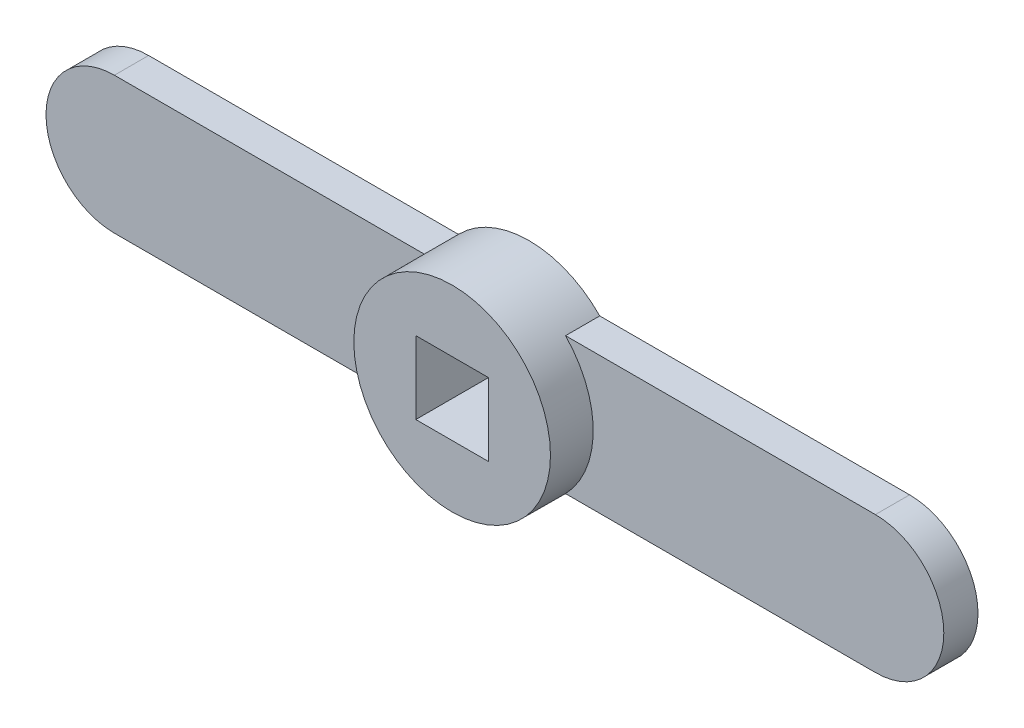
ISO-10303-21;
HEADER;
FILE_DESCRIPTION(('STEP AP214'),'2;1');
FILE_NAME('part.step','',(''),(''),'','','');
FILE_SCHEMA(('AUTOMOTIVE_DESIGN { 1 0 10303 214 1 1 1 1 }'));
ENDSEC;
DATA;
#1=APPLICATION_CONTEXT('core data for automotive mechanical design processes');
#2=APPLICATION_PROTOCOL_DEFINITION('international standard','automotive_design',2000,#1);
#3=PRODUCT_CONTEXT('',#1,'mechanical');
#4=PRODUCT('Part','Part','',(#3));
#5=PRODUCT_RELATED_PRODUCT_CATEGORY('part','',(#4));
#6=PRODUCT_DEFINITION_FORMATION('','',#4);
#7=PRODUCT_DEFINITION_CONTEXT('part definition',#1,'design');
#8=PRODUCT_DEFINITION('design','',#6,#7);
#9=PRODUCT_DEFINITION_SHAPE('','',#8);
#10=(LENGTH_UNIT() NAMED_UNIT(*) SI_UNIT(.MILLI.,.METRE.));
#11=(NAMED_UNIT(*) PLANE_ANGLE_UNIT() SI_UNIT($,.RADIAN.));
#12=(NAMED_UNIT(*) SI_UNIT($,.STERADIAN.) SOLID_ANGLE_UNIT());
#13=UNCERTAINTY_MEASURE_WITH_UNIT(LENGTH_MEASURE(1.E-05),#10,'distance_accuracy_value','');
#14=(GEOMETRIC_REPRESENTATION_CONTEXT(3) GLOBAL_UNCERTAINTY_ASSIGNED_CONTEXT((#13)) GLOBAL_UNIT_ASSIGNED_CONTEXT((#10,
#11,#12)) REPRESENTATION_CONTEXT('',''));
#15=CARTESIAN_POINT('',(0.,0.,0.));
#16=DIRECTION('',(0.,0.,1.));
#17=DIRECTION('',(1.,0.,0.));
#18=AXIS2_PLACEMENT_3D('',#15,#16,#17);
#19=CARTESIAN_POINT('',(-44.5000000000006,-8.00000000000008,4.));
#20=DIRECTION('',(0.,1.00000000000002,0.));
#21=DIRECTION('',(0.,0.,1.));
#22=AXIS2_PLACEMENT_3D('',#19,#20,#21);
#23=PLANE('',#22);
#24=DIRECTION('',(1.00000000000002,0.,0.));
#25=VECTOR('',#24,1.);
#26=CARTESIAN_POINT('',(-44.5000000000006,-8.00000000000008,4.));
#27=LINE('',#26,#25);
#28=CARTESIAN_POINT('',(8.26135582092915,-8.00000000000007,4.));
#29=VERTEX_POINT('',#28);
#30=CARTESIAN_POINT('',(44.5000000000007,-8.00000000000008,4.));
#31=VERTEX_POINT('',#30);
#32=EDGE_CURVE('E195',#29,#31,#27,.T.);
#33=ORIENTED_EDGE('',*,*,#32,.F.);
#34=DIRECTION('',(0.,0.,-1.));
#35=VECTOR('',#34,1.);
#36=CARTESIAN_POINT('',(8.26135582092915,-8.00000000000007,8.99999999999999));
#37=LINE('',#36,#35);
#38=CARTESIAN_POINT('',(8.26135582092916,-8.00000000000015,0.));
#39=VERTEX_POINT('',#38);
#40=EDGE_CURVE('E185',#29,#39,#37,.T.);
#41=ORIENTED_EDGE('',*,*,#40,.T.);
#42=DIRECTION('',(1.00000000000002,0.,0.));
#43=VECTOR('',#42,1.);
#44=CARTESIAN_POINT('',(-44.5000000000007,-8.00000000000015,0.));
#45=LINE('',#44,#43);
#46=CARTESIAN_POINT('',(44.5000000000001,-8.00000000000014,0.));
#47=VERTEX_POINT('',#46);
#48=EDGE_CURVE('E208',#39,#47,#45,.T.);
#49=ORIENTED_EDGE('',*,*,#48,.T.);
#50=DIRECTION('',(0.,0.,-1.));
#51=VECTOR('',#50,1.);
#52=CARTESIAN_POINT('',(44.5000000000007,-8.00000000000008,4.));
#53=LINE('',#52,#51);
#54=EDGE_CURVE('E54',#31,#47,#53,.T.);
#55=ORIENTED_EDGE('',*,*,#54,.F.);
#56=EDGE_LOOP('',(#33,#41,#49,#55));
#57=FACE_BOUND('',#56,.T.);
#58=ADVANCED_FACE('F46',(#57),#23,.F.);
#59=CARTESIAN_POINT('',(-44.5000000000006,8.00000000000023,3.99999999999935));
#60=DIRECTION('',(0.,-1.00000000000002,0.));
#61=DIRECTION('',(0.,0.,-1.));
#62=AXIS2_PLACEMENT_3D('',#59,#60,#61);
#63=PLANE('',#62);
#64=DIRECTION('',(-1.00000000000002,0.,0.));
#65=VECTOR('',#64,1.);
#66=CARTESIAN_POINT('',(-44.5000000000006,8.00000000000023,3.99999999999935));
#67=LINE('',#66,#65);
#68=CARTESIAN_POINT('',(-8.26135582092946,8.00000000000024,4.));
#69=VERTEX_POINT('',#68);
#70=CARTESIAN_POINT('',(-44.5000000000006,8.00000000000023,3.99999999999935));
#71=VERTEX_POINT('',#70);
#72=EDGE_CURVE('E202',#69,#71,#67,.T.);
#73=ORIENTED_EDGE('',*,*,#72,.F.);
#74=DIRECTION('',(0.,0.,-1.));
#75=VECTOR('',#74,1.);
#76=CARTESIAN_POINT('',(-8.26135582092948,8.00000000000025,9.00000000000001));
#77=LINE('',#76,#75);
#78=CARTESIAN_POINT('',(-8.26135582092946,8.00000000000016,0.));
#79=VERTEX_POINT('',#78);
#80=EDGE_CURVE('E187',#69,#79,#77,.T.);
#81=ORIENTED_EDGE('',*,*,#80,.T.);
#82=DIRECTION('',(-1.00000000000002,0.,0.));
#83=VECTOR('',#82,1.);
#84=CARTESIAN_POINT('',(-44.5000000000006,8.00000000000016,-6.24500451351651E-13));
#85=LINE('',#84,#83);
#86=CARTESIAN_POINT('',(-44.5000000000006,8.00000000000016,-6.24500451351651E-13));
#87=VERTEX_POINT('',#86);
#88=EDGE_CURVE('E213',#79,#87,#85,.T.);
#89=ORIENTED_EDGE('',*,*,#88,.T.);
#90=DIRECTION('',(0.,0.,-1.));
#91=VECTOR('',#90,1.);
#92=CARTESIAN_POINT('',(-44.5000000000006,8.00000000000023,3.99999999999935));
#93=LINE('',#92,#91);
#94=EDGE_CURVE('E205',#71,#87,#93,.T.);
#95=ORIENTED_EDGE('',*,*,#94,.F.);
#96=EDGE_LOOP('',(#73,#81,#89,#95));
#97=FACE_BOUND('',#96,.T.);
#98=ADVANCED_FACE('F248',(#97),#63,.F.);
#99=CARTESIAN_POINT('',(-44.5000000000006,0.,4.));
#100=DIRECTION('',(0.,0.,1.));
#101=DIRECTION('',(1.00000000000002,0.,0.));
#102=AXIS2_PLACEMENT_3D('',#99,#100,#101);
#103=PLANE('',#102);
#104=CARTESIAN_POINT('',(0.,0.,4.));
#105=DIRECTION('',(0.,0.,1.));
#106=DIRECTION('',(1.00000000000002,0.,0.));
#107=AXIS2_PLACEMENT_3D('',#104,#105,#106);
#108=CIRCLE('',#107,11.5);
#109=CARTESIAN_POINT('',(-8.26135582092946,-8.00000000000007,3.99999999999999));
#110=VERTEX_POINT('',#109);
#111=EDGE_CURVE('E182',#69,#110,#108,.T.);
#112=ORIENTED_EDGE('',*,*,#111,.F.);
#113=ORIENTED_EDGE('',*,*,#72,.T.);
#114=CARTESIAN_POINT('',(-44.5000000000006,0.,4.));
#115=DIRECTION('',(0.,0.,1.));
#116=DIRECTION('',(1.00000000000002,0.,0.));
#117=AXIS2_PLACEMENT_3D('',#114,#115,#116);
#118=CIRCLE('',#117,8.);
#119=CARTESIAN_POINT('',(-44.5000000000006,-8.00000000000008,4.));
#120=VERTEX_POINT('',#119);
#121=EDGE_CURVE('E192',#71,#120,#118,.T.);
#122=ORIENTED_EDGE('',*,*,#121,.T.);
#123=EDGE_CURVE('E197',#120,#110,#27,.T.);
#124=ORIENTED_EDGE('',*,*,#123,.T.);
#125=EDGE_LOOP('',(#112,#113,#122,#124));
#126=FACE_BOUND('',#125,.T.);
#127=ADVANCED_FACE('F253',(#126),#103,.T.);
#128=CARTESIAN_POINT('',(-44.5000000000006,0.,4.));
#129=DIRECTION('',(0.,0.,-1.));
#130=DIRECTION('',(-1.00000000000002,0.,0.));
#131=AXIS2_PLACEMENT_3D('',#128,#129,#130);
#132=CYLINDRICAL_SURFACE('',#131,8.);
#133=CARTESIAN_POINT('',(-44.5000000000007,0.,0.));
#134=DIRECTION('',(0.,0.,1.));
#135=DIRECTION('',(1.00000000000002,0.,0.));
#136=AXIS2_PLACEMENT_3D('',#133,#134,#135);
#137=CIRCLE('',#136,8.);
#138=CARTESIAN_POINT('',(-44.5000000000007,-8.00000000000015,0.));
#139=VERTEX_POINT('',#138);
#140=EDGE_CURVE('E191',#87,#139,#137,.T.);
#141=ORIENTED_EDGE('',*,*,#140,.T.);
#142=DIRECTION('',(0.,0.,-1.));
#143=VECTOR('',#142,1.);
#144=CARTESIAN_POINT('',(-44.5000000000006,-8.00000000000008,4.));
#145=LINE('',#144,#143);
#146=EDGE_CURVE('E13',#120,#139,#145,.T.);
#147=ORIENTED_EDGE('',*,*,#146,.F.);
#148=ORIENTED_EDGE('',*,*,#121,.F.);
#149=ORIENTED_EDGE('',*,*,#94,.T.);
#150=EDGE_LOOP('',(#141,#147,#148,#149));
#151=FACE_BOUND('',#150,.T.);
#152=ADVANCED_FACE('F48',(#151),#132,.T.);
#153=CARTESIAN_POINT('',(-8.26135582092946,-8.00000000000015,0.));
#154=VERTEX_POINT('',#153);
#155=EDGE_CURVE('E209',#139,#154,#45,.T.);
#156=ORIENTED_EDGE('',*,*,#155,.T.);
#157=DIRECTION('',(0.,0.,-1.));
#158=VECTOR('',#157,1.);
#159=CARTESIAN_POINT('',(-8.26135582092948,-8.00000000000007,8.99999999999999));
#160=LINE('',#159,#158);
#161=EDGE_CURVE('E189',#154,#110,#160,.F.);
#162=ORIENTED_EDGE('',*,*,#161,.T.);
#163=ORIENTED_EDGE('',*,*,#123,.F.);
#164=ORIENTED_EDGE('',*,*,#146,.T.);
#165=EDGE_LOOP('',(#156,#162,#163,#164));
#166=FACE_BOUND('',#165,.T.);
#167=ADVANCED_FACE('F249',(#166),#23,.F.);
#168=CARTESIAN_POINT('',(44.5000000000007,0.,3.99999999999938));
#169=DIRECTION('',(0.,0.,-1.));
#170=DIRECTION('',(-1.00000000000002,0.,0.));
#171=AXIS2_PLACEMENT_3D('',#168,#169,#170);
#172=CYLINDRICAL_SURFACE('',#171,8.);
#173=CARTESIAN_POINT('',(44.5000000000001,0.,-6.24500451351651E-13));
#174=DIRECTION('',(0.,0.,1.));
#175=DIRECTION('',(1.00000000000002,0.,0.));
#176=AXIS2_PLACEMENT_3D('',#173,#174,#175);
#177=CIRCLE('',#176,8.);
#178=CARTESIAN_POINT('',(44.5000000000001,8.00000000000017,-6.24500451351651E-13));
#179=VERTEX_POINT('',#178);
#180=EDGE_CURVE('E211',#47,#179,#177,.T.);
#181=ORIENTED_EDGE('',*,*,#180,.T.);
#182=DIRECTION('',(0.,0.,-1.));
#183=VECTOR('',#182,1.);
#184=CARTESIAN_POINT('',(44.5000000000006,8.00000000000024,3.99999999999938));
#185=LINE('',#184,#183);
#186=CARTESIAN_POINT('',(44.5000000000006,8.00000000000024,3.99999999999938));
#187=VERTEX_POINT('',#186);
#188=EDGE_CURVE('E217',#187,#179,#185,.T.);
#189=ORIENTED_EDGE('',*,*,#188,.F.);
#190=CARTESIAN_POINT('',(44.5000000000007,0.,3.99999999999938));
#191=DIRECTION('',(0.,0.,1.));
#192=DIRECTION('',(1.00000000000002,0.,0.));
#193=AXIS2_PLACEMENT_3D('',#190,#191,#192);
#194=CIRCLE('',#193,8.);
#195=EDGE_CURVE('E200',#31,#187,#194,.T.);
#196=ORIENTED_EDGE('',*,*,#195,.F.);
#197=ORIENTED_EDGE('',*,*,#54,.T.);
#198=EDGE_LOOP('',(#181,#189,#196,#197));
#199=FACE_BOUND('',#198,.T.);
#200=ADVANCED_FACE('F224',(#199),#172,.T.);
#201=CARTESIAN_POINT('',(8.26135582092914,8.00000000000016,0.));
#202=VERTEX_POINT('',#201);
#203=EDGE_CURVE('E196',#179,#202,#85,.T.);
#204=ORIENTED_EDGE('',*,*,#203,.T.);
#205=DIRECTION('',(0.,0.,-1.));
#206=VECTOR('',#205,1.);
#207=CARTESIAN_POINT('',(8.26135582092913,8.00000000000024,9.00000000000001));
#208=LINE('',#207,#206);
#209=CARTESIAN_POINT('',(8.26135582092916,8.00000000000025,4.));
#210=VERTEX_POINT('',#209);
#211=EDGE_CURVE('E181',#202,#210,#208,.F.);
#212=ORIENTED_EDGE('',*,*,#211,.T.);
#213=EDGE_CURVE('E203',#187,#210,#67,.T.);
#214=ORIENTED_EDGE('',*,*,#213,.F.);
#215=ORIENTED_EDGE('',*,*,#188,.T.);
#216=EDGE_LOOP('',(#204,#212,#214,#215));
#217=FACE_BOUND('',#216,.T.);
#218=ADVANCED_FACE('F238',(#217),#63,.F.);
#219=EDGE_CURVE('E175',#29,#210,#108,.T.);
#220=ORIENTED_EDGE('',*,*,#219,.F.);
#221=ORIENTED_EDGE('',*,*,#32,.T.);
#222=ORIENTED_EDGE('',*,*,#195,.T.);
#223=ORIENTED_EDGE('',*,*,#213,.T.);
#224=EDGE_LOOP('',(#220,#221,#222,#223));
#225=FACE_BOUND('',#224,.T.);
#226=ADVANCED_FACE('F246',(#225),#103,.T.);
#227=CARTESIAN_POINT('',(-44.5000000000007,0.,0.));
#228=DIRECTION('',(0.,0.,1.));
#229=DIRECTION('',(1.00000000000002,0.,0.));
#230=AXIS2_PLACEMENT_3D('',#227,#228,#229);
#231=PLANE('',#230);
#232=DIRECTION('',(1.00000000000002,0.,0.));
#233=VECTOR('',#232,1.);
#234=CARTESIAN_POINT('',(4.24999999999999,4.25000000000009,0.));
#235=LINE('',#234,#233);
#236=CARTESIAN_POINT('',(-4.25000000000016,4.25000000000008,0.));
#237=VERTEX_POINT('',#236);
#238=CARTESIAN_POINT('',(4.24999999999999,4.25000000000009,0.));
#239=VERTEX_POINT('',#238);
#240=EDGE_CURVE('E162',#237,#239,#235,.T.);
#241=ORIENTED_EDGE('',*,*,#240,.F.);
#242=DIRECTION('',(0.,1.00000000000002,0.));
#243=VECTOR('',#242,1.);
#244=CARTESIAN_POINT('',(-4.25000000000016,-4.25000000000007,-6.24500451351651E-13));
#245=LINE('',#244,#243);
#246=CARTESIAN_POINT('',(-4.25000000000016,-4.25000000000007,-6.24500451351651E-13));
#247=VERTEX_POINT('',#246);
#248=EDGE_CURVE('E61',#247,#237,#245,.T.);
#249=ORIENTED_EDGE('',*,*,#248,.F.);
#250=DIRECTION('',(-1.00000000000002,0.,0.));
#251=VECTOR('',#250,1.);
#252=CARTESIAN_POINT('',(4.25,-4.25000000000007,-6.24500451351651E-13));
#253=LINE('',#252,#251);
#254=CARTESIAN_POINT('',(4.25,-4.25000000000007,-6.24500451351651E-13));
#255=VERTEX_POINT('',#254);
#256=EDGE_CURVE('E153',#255,#247,#253,.T.);
#257=ORIENTED_EDGE('',*,*,#256,.F.);
#258=DIRECTION('',(0.,-1.00000000000002,0.));
#259=VECTOR('',#258,1.);
#260=CARTESIAN_POINT('',(4.25,-4.25000000000007,-6.24500451351651E-13));
#261=LINE('',#260,#259);
#262=EDGE_CURVE('E156',#239,#255,#261,.T.);
#263=ORIENTED_EDGE('',*,*,#262,.F.);
#264=EDGE_LOOP('',(#241,#249,#257,#263));
#265=FACE_BOUND('',#264,.T.);
#266=ORIENTED_EDGE('',*,*,#48,.F.);
#267=CARTESIAN_POINT('',(0.,0.,0.));
#268=DIRECTION('',(0.,0.,-1.));
#269=DIRECTION('',(-1.00000000000002,0.,0.));
#270=AXIS2_PLACEMENT_3D('',#267,#268,#269);
#271=CIRCLE('',#270,11.5);
#272=EDGE_CURVE('E168',#39,#154,#271,.T.);
#273=ORIENTED_EDGE('',*,*,#272,.T.);
#274=ORIENTED_EDGE('',*,*,#155,.F.);
#275=ORIENTED_EDGE('',*,*,#140,.F.);
#276=ORIENTED_EDGE('',*,*,#88,.F.);
#277=EDGE_CURVE('E176',#79,#202,#271,.T.);
#278=ORIENTED_EDGE('',*,*,#277,.T.);
#279=ORIENTED_EDGE('',*,*,#203,.F.);
#280=ORIENTED_EDGE('',*,*,#180,.F.);
#281=EDGE_LOOP('',(#266,#273,#274,#275,#276,#278,#279,#280));
#282=FACE_BOUND('',#281,.T.);
#283=ADVANCED_FACE('F231',(#265,#282),#231,.F.);
#284=CARTESIAN_POINT('',(0.,0.,8.99999999999999));
#285=DIRECTION('',(0.,0.,-1.));
#286=DIRECTION('',(-1.00000000000002,0.,0.));
#287=AXIS2_PLACEMENT_3D('',#284,#285,#286);
#288=CYLINDRICAL_SURFACE('',#287,11.5);
#289=CARTESIAN_POINT('',(0.,0.,8.99999999999999));
#290=DIRECTION('',(0.,0.,-1.));
#291=DIRECTION('',(-1.00000000000002,0.,0.));
#292=AXIS2_PLACEMENT_3D('',#289,#290,#291);
#293=CIRCLE('',#292,11.5);
#294=CARTESIAN_POINT('',(-11.5000000000002,0.,8.99999999999999));
#295=VERTEX_POINT('',#294);
#296=EDGE_CURVE('E172',#295,#295,#293,.T.);
#297=ORIENTED_EDGE('',*,*,#296,.T.);
#298=EDGE_LOOP('',(#297));
#299=FACE_BOUND('',#298,.T.);
#300=ORIENTED_EDGE('',*,*,#161,.F.);
#301=ORIENTED_EDGE('',*,*,#272,.F.);
#302=ORIENTED_EDGE('',*,*,#40,.F.);
#303=ORIENTED_EDGE('',*,*,#219,.T.);
#304=ORIENTED_EDGE('',*,*,#211,.F.);
#305=ORIENTED_EDGE('',*,*,#277,.F.);
#306=ORIENTED_EDGE('',*,*,#80,.F.);
#307=ORIENTED_EDGE('',*,*,#111,.T.);
#308=EDGE_LOOP('',(#300,#301,#302,#303,#304,#305,#306,#307));
#309=FACE_BOUND('',#308,.T.);
#310=ADVANCED_FACE('F242',(#299,#309),#288,.T.);
#311=CARTESIAN_POINT('',(0.,0.,8.99999999999999));
#312=DIRECTION('',(0.,0.,-1.));
#313=DIRECTION('',(-1.00000000000002,0.,0.));
#314=AXIS2_PLACEMENT_3D('',#311,#312,#313);
#315=PLANE('',#314);
#316=DIRECTION('',(-1.00000000000002,0.,0.));
#317=VECTOR('',#316,1.);
#318=CARTESIAN_POINT('',(4.25,-4.25000000000008,8.99999999999938));
#319=LINE('',#318,#317);
#320=CARTESIAN_POINT('',(4.25,-4.25000000000008,8.99999999999938));
#321=VERTEX_POINT('',#320);
#322=CARTESIAN_POINT('',(-4.25000000000032,-4.25000000000007,8.99999999999938));
#323=VERTEX_POINT('',#322);
#324=EDGE_CURVE('E143',#321,#323,#319,.T.);
#325=ORIENTED_EDGE('',*,*,#324,.T.);
#326=DIRECTION('',(0.,1.00000000000002,0.));
#327=VECTOR('',#326,1.);
#328=CARTESIAN_POINT('',(-4.25000000000032,-4.25000000000007,8.99999999999938));
#329=LINE('',#328,#327);
#330=CARTESIAN_POINT('',(-4.25000000000032,4.25000000000009,8.99999999999999));
#331=VERTEX_POINT('',#330);
#332=EDGE_CURVE('E137',#323,#331,#329,.T.);
#333=ORIENTED_EDGE('',*,*,#332,.T.);
#334=DIRECTION('',(1.00000000000002,0.,0.));
#335=VECTOR('',#334,1.);
#336=CARTESIAN_POINT('',(4.24999999999999,4.25000000000009,8.99999999999999));
#337=LINE('',#336,#335);
#338=CARTESIAN_POINT('',(4.24999999999999,4.25000000000009,8.99999999999999));
#339=VERTEX_POINT('',#338);
#340=EDGE_CURVE('E146',#331,#339,#337,.T.);
#341=ORIENTED_EDGE('',*,*,#340,.T.);
#342=DIRECTION('',(0.,-1.00000000000002,0.));
#343=VECTOR('',#342,1.);
#344=CARTESIAN_POINT('',(4.25,-4.25000000000008,8.99999999999938));
#345=LINE('',#344,#343);
#346=EDGE_CURVE('E69',#339,#321,#345,.T.);
#347=ORIENTED_EDGE('',*,*,#346,.T.);
#348=EDGE_LOOP('',(#325,#333,#341,#347));
#349=FACE_BOUND('',#348,.T.);
#350=ORIENTED_EDGE('',*,*,#296,.F.);
#351=EDGE_LOOP('',(#350));
#352=FACE_BOUND('',#351,.T.);
#353=ADVANCED_FACE('F150',(#349,#352),#315,.F.);
#354=CARTESIAN_POINT('',(-4.25000000000032,-4.25000000000007,8.99999999999938));
#355=DIRECTION('',(-1.00000000000002,0.,0.));
#356=DIRECTION('',(0.,0.,1.));
#357=AXIS2_PLACEMENT_3D('',#354,#355,#356);
#358=PLANE('',#357);
#359=ORIENTED_EDGE('',*,*,#248,.T.);
#360=DIRECTION('',(0.,0.,-1.));
#361=VECTOR('',#360,1.);
#362=CARTESIAN_POINT('',(-4.25000000000032,4.25000000000009,8.99999999999999));
#363=LINE('',#362,#361);
#364=EDGE_CURVE('E133',#331,#237,#363,.T.);
#365=ORIENTED_EDGE('',*,*,#364,.F.);
#366=ORIENTED_EDGE('',*,*,#332,.F.);
#367=DIRECTION('',(0.,0.,-1.));
#368=VECTOR('',#367,1.);
#369=CARTESIAN_POINT('',(-4.25000000000032,-4.25000000000007,8.99999999999938));
#370=LINE('',#369,#368);
#371=EDGE_CURVE('E166',#323,#247,#370,.T.);
#372=ORIENTED_EDGE('',*,*,#371,.T.);
#373=EDGE_LOOP('',(#359,#365,#366,#372));
#374=FACE_BOUND('',#373,.T.);
#375=ADVANCED_FACE('F135',(#374),#358,.F.);
#376=CARTESIAN_POINT('',(4.25,-4.25000000000008,8.99999999999938));
#377=DIRECTION('',(0.,-1.00000000000002,0.));
#378=DIRECTION('',(0.,0.,-1.));
#379=AXIS2_PLACEMENT_3D('',#376,#377,#378);
#380=PLANE('',#379);
#381=ORIENTED_EDGE('',*,*,#256,.T.);
#382=ORIENTED_EDGE('',*,*,#371,.F.);
#383=ORIENTED_EDGE('',*,*,#324,.F.);
#384=DIRECTION('',(0.,0.,-1.));
#385=VECTOR('',#384,1.);
#386=CARTESIAN_POINT('',(4.25,-4.25000000000008,8.99999999999938));
#387=LINE('',#386,#385);
#388=EDGE_CURVE('E169',#321,#255,#387,.T.);
#389=ORIENTED_EDGE('',*,*,#388,.T.);
#390=EDGE_LOOP('',(#381,#382,#383,#389));
#391=FACE_BOUND('',#390,.T.);
#392=ADVANCED_FACE('F346',(#391),#380,.F.);
#393=CARTESIAN_POINT('',(4.25,-4.25000000000008,8.99999999999938));
#394=DIRECTION('',(1.00000000000002,0.,0.));
#395=DIRECTION('',(0.,1.00000000000002,0.));
#396=AXIS2_PLACEMENT_3D('',#393,#394,#395);
#397=PLANE('',#396);
#398=ORIENTED_EDGE('',*,*,#262,.T.);
#399=ORIENTED_EDGE('',*,*,#388,.F.);
#400=ORIENTED_EDGE('',*,*,#346,.F.);
#401=DIRECTION('',(0.,0.,-1.));
#402=VECTOR('',#401,1.);
#403=CARTESIAN_POINT('',(4.24999999999999,4.25000000000009,8.99999999999999));
#404=LINE('',#403,#402);
#405=EDGE_CURVE('E142',#339,#239,#404,.T.);
#406=ORIENTED_EDGE('',*,*,#405,.T.);
#407=EDGE_LOOP('',(#398,#399,#400,#406));
#408=FACE_BOUND('',#407,.T.);
#409=ADVANCED_FACE('F354',(#408),#397,.F.);
#410=CARTESIAN_POINT('',(4.24999999999999,4.25000000000009,8.99999999999999));
#411=DIRECTION('',(0.,1.00000000000002,0.));
#412=DIRECTION('',(0.,0.,1.));
#413=AXIS2_PLACEMENT_3D('',#410,#411,#412);
#414=PLANE('',#413);
#415=ORIENTED_EDGE('',*,*,#240,.T.);
#416=ORIENTED_EDGE('',*,*,#405,.F.);
#417=ORIENTED_EDGE('',*,*,#340,.F.);
#418=ORIENTED_EDGE('',*,*,#364,.T.);
#419=EDGE_LOOP('',(#415,#416,#417,#418));
#420=FACE_BOUND('',#419,.T.);
#421=ADVANCED_FACE('F147',(#420),#414,.F.);
#422=CLOSED_SHELL('',(#58,#98,#127,#152,#167,#200,#218,#226,#283,#310,#353,#375,#392,#409,#421));
#423=MANIFOLD_SOLID_BREP('B2',#422);
#424=ADVANCED_BREP_SHAPE_REPRESENTATION('',(#18,#423),#14);
#425=SHAPE_DEFINITION_REPRESENTATION(#9,#424);
ENDSEC;
END-ISO-10303-21;
